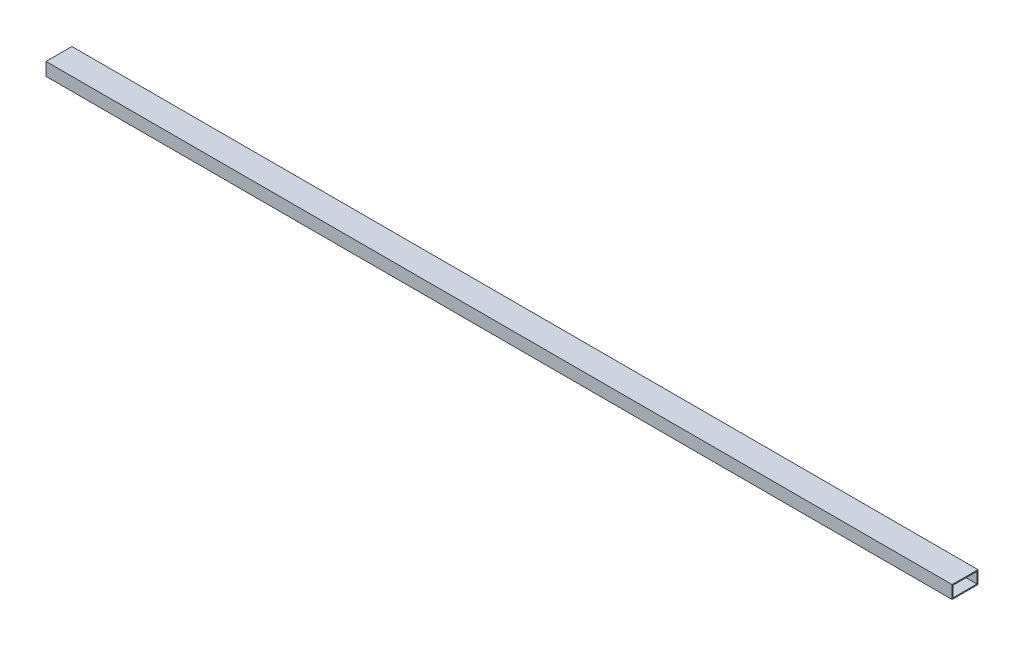
ISO-10303-21;
HEADER;
FILE_DESCRIPTION(('STEP AP214'),'2;1');
FILE_NAME('part.step','',(''),(''),'','','');
FILE_SCHEMA(('AUTOMOTIVE_DESIGN { 1 0 10303 214 1 1 1 1 }'));
ENDSEC;
DATA;
#1=APPLICATION_CONTEXT('core data for automotive mechanical design processes');
#2=APPLICATION_PROTOCOL_DEFINITION('international standard','automotive_design',2000,#1);
#3=PRODUCT_CONTEXT('',#1,'mechanical');
#4=PRODUCT('Part','Part','',(#3));
#5=PRODUCT_RELATED_PRODUCT_CATEGORY('part','',(#4));
#6=PRODUCT_DEFINITION_FORMATION('','',#4);
#7=PRODUCT_DEFINITION_CONTEXT('part definition',#1,'design');
#8=PRODUCT_DEFINITION('design','',#6,#7);
#9=PRODUCT_DEFINITION_SHAPE('','',#8);
#10=(LENGTH_UNIT() NAMED_UNIT(*) SI_UNIT(.MILLI.,.METRE.));
#11=(NAMED_UNIT(*) PLANE_ANGLE_UNIT() SI_UNIT($,.RADIAN.));
#12=(NAMED_UNIT(*) SI_UNIT($,.STERADIAN.) SOLID_ANGLE_UNIT());
#13=UNCERTAINTY_MEASURE_WITH_UNIT(LENGTH_MEASURE(1.E-05),#10,'distance_accuracy_value','');
#14=(GEOMETRIC_REPRESENTATION_CONTEXT(3) GLOBAL_UNCERTAINTY_ASSIGNED_CONTEXT((#13)) GLOBAL_UNIT_ASSIGNED_CONTEXT((#10,
#11,#12)) REPRESENTATION_CONTEXT('',''));
#15=CARTESIAN_POINT('',(0.,0.,0.));
#16=DIRECTION('',(0.,0.,1.));
#17=DIRECTION('',(1.,0.,0.));
#18=AXIS2_PLACEMENT_3D('',#15,#16,#17);
#19=CARTESIAN_POINT('',(3500.,0.,0.));
#20=DIRECTION('',(1.,0.,0.));
#21=DIRECTION('',(0.,-1.,0.));
#22=AXIS2_PLACEMENT_3D('',#19,#20,#21);
#23=PLANE('',#22);
#24=DIRECTION('',(0.,0.,1.));
#25=VECTOR('',#24,1.);
#26=CARTESIAN_POINT('',(3500.,21.,-46.));
#27=LINE('',#26,#25);
#28=CARTESIAN_POINT('',(3500.,21.,-46.));
#29=VERTEX_POINT('',#28);
#30=CARTESIAN_POINT('',(3500.,21.,46.));
#31=VERTEX_POINT('',#30);
#32=EDGE_CURVE('E141',#29,#31,#27,.T.);
#33=ORIENTED_EDGE('',*,*,#32,.F.);
#34=DIRECTION('',(0.,1.,0.));
#35=VECTOR('',#34,1.);
#36=CARTESIAN_POINT('',(3500.,-21.,-46.));
#37=LINE('',#36,#35);
#38=CARTESIAN_POINT('',(3500.,-21.,-46.));
#39=VERTEX_POINT('',#38);
#40=EDGE_CURVE('E154',#39,#29,#37,.T.);
#41=ORIENTED_EDGE('',*,*,#40,.F.);
#42=DIRECTION('',(0.,0.,-1.));
#43=VECTOR('',#42,1.);
#44=CARTESIAN_POINT('',(3500.,-21.,46.));
#45=LINE('',#44,#43);
#46=CARTESIAN_POINT('',(3500.,-21.,46.));
#47=VERTEX_POINT('',#46);
#48=EDGE_CURVE('E161',#47,#39,#45,.T.);
#49=ORIENTED_EDGE('',*,*,#48,.F.);
#50=DIRECTION('',(0.,-1.,0.));
#51=VECTOR('',#50,1.);
#52=CARTESIAN_POINT('',(3500.,21.,46.));
#53=LINE('',#52,#51);
#54=EDGE_CURVE('E25',#31,#47,#53,.T.);
#55=ORIENTED_EDGE('',*,*,#54,.F.);
#56=EDGE_LOOP('',(#33,#41,#49,#55));
#57=FACE_BOUND('',#56,.T.);
#58=DIRECTION('',(0.,-1.,0.));
#59=VECTOR('',#58,1.);
#60=CARTESIAN_POINT('',(3500.,25.,50.));
#61=LINE('',#60,#59);
#62=CARTESIAN_POINT('',(3500.,25.,50.));
#63=VERTEX_POINT('',#62);
#64=CARTESIAN_POINT('',(3500.,-25.,50.));
#65=VERTEX_POINT('',#64);
#66=EDGE_CURVE('E260',#63,#65,#61,.T.);
#67=ORIENTED_EDGE('',*,*,#66,.T.);
#68=DIRECTION('',(0.,0.,-1.));
#69=VECTOR('',#68,1.);
#70=CARTESIAN_POINT('',(3500.,-25.,50.));
#71=LINE('',#70,#69);
#72=CARTESIAN_POINT('',(3500.,-25.,-50.));
#73=VERTEX_POINT('',#72);
#74=EDGE_CURVE('E125',#65,#73,#71,.T.);
#75=ORIENTED_EDGE('',*,*,#74,.T.);
#76=DIRECTION('',(0.,1.,0.));
#77=VECTOR('',#76,1.);
#78=CARTESIAN_POINT('',(3500.,-25.,-50.));
#79=LINE('',#78,#77);
#80=CARTESIAN_POINT('',(3500.,25.,-50.));
#81=VERTEX_POINT('',#80);
#82=EDGE_CURVE('E93',#73,#81,#79,.T.);
#83=ORIENTED_EDGE('',*,*,#82,.T.);
#84=DIRECTION('',(0.,0.,1.));
#85=VECTOR('',#84,1.);
#86=CARTESIAN_POINT('',(3500.,25.,-50.));
#87=LINE('',#86,#85);
#88=EDGE_CURVE('E113',#81,#63,#87,.T.);
#89=ORIENTED_EDGE('',*,*,#88,.T.);
#90=EDGE_LOOP('',(#67,#75,#83,#89));
#91=FACE_BOUND('',#90,.T.);
#92=ADVANCED_FACE('F17',(#57,#91),#23,.T.);
#93=CARTESIAN_POINT('',(2.273736754432E-13,0.,0.));
#94=DIRECTION('',(1.,0.,0.));
#95=DIRECTION('',(0.,-1.,0.));
#96=AXIS2_PLACEMENT_3D('',#93,#94,#95);
#97=PLANE('',#96);
#98=DIRECTION('',(0.,-1.,0.));
#99=VECTOR('',#98,1.);
#100=CARTESIAN_POINT('',(2.273736754432E-13,21.,46.));
#101=LINE('',#100,#99);
#102=CARTESIAN_POINT('',(2.273736754432E-13,21.,46.));
#103=VERTEX_POINT('',#102);
#104=CARTESIAN_POINT('',(2.273736754432E-13,-21.,46.));
#105=VERTEX_POINT('',#104);
#106=EDGE_CURVE('E11',#103,#105,#101,.T.);
#107=ORIENTED_EDGE('',*,*,#106,.T.);
#108=DIRECTION('',(0.,0.,-1.));
#109=VECTOR('',#108,1.);
#110=CARTESIAN_POINT('',(2.273736754432E-13,-21.,46.));
#111=LINE('',#110,#109);
#112=CARTESIAN_POINT('',(2.273736754432E-13,-21.,-46.));
#113=VERTEX_POINT('',#112);
#114=EDGE_CURVE('E158',#105,#113,#111,.T.);
#115=ORIENTED_EDGE('',*,*,#114,.T.);
#116=DIRECTION('',(0.,1.,0.));
#117=VECTOR('',#116,1.);
#118=CARTESIAN_POINT('',(2.273736754432E-13,-21.,-46.));
#119=LINE('',#118,#117);
#120=CARTESIAN_POINT('',(2.273736754432E-13,21.,-46.));
#121=VERTEX_POINT('',#120);
#122=EDGE_CURVE('E157',#113,#121,#119,.T.);
#123=ORIENTED_EDGE('',*,*,#122,.T.);
#124=DIRECTION('',(0.,0.,1.));
#125=VECTOR('',#124,1.);
#126=CARTESIAN_POINT('',(2.273736754432E-13,21.,-46.));
#127=LINE('',#126,#125);
#128=EDGE_CURVE('E132',#121,#103,#127,.T.);
#129=ORIENTED_EDGE('',*,*,#128,.T.);
#130=EDGE_LOOP('',(#107,#115,#123,#129));
#131=FACE_BOUND('',#130,.T.);
#132=DIRECTION('',(0.,0.,1.));
#133=VECTOR('',#132,1.);
#134=CARTESIAN_POINT('',(2.273736754432E-13,25.,-50.));
#135=LINE('',#134,#133);
#136=CARTESIAN_POINT('',(2.273736754432E-13,25.,-50.));
#137=VERTEX_POINT('',#136);
#138=CARTESIAN_POINT('',(2.273736754432E-13,25.,50.));
#139=VERTEX_POINT('',#138);
#140=EDGE_CURVE('E100',#137,#139,#135,.T.);
#141=ORIENTED_EDGE('',*,*,#140,.F.);
#142=DIRECTION('',(0.,1.,0.));
#143=VECTOR('',#142,1.);
#144=CARTESIAN_POINT('',(2.273736754432E-13,-25.,-50.));
#145=LINE('',#144,#143);
#146=CARTESIAN_POINT('',(2.273736754432E-13,-25.,-50.));
#147=VERTEX_POINT('',#146);
#148=EDGE_CURVE('E105',#147,#137,#145,.T.);
#149=ORIENTED_EDGE('',*,*,#148,.F.);
#150=DIRECTION('',(0.,0.,-1.));
#151=VECTOR('',#150,1.);
#152=CARTESIAN_POINT('',(2.273736754432E-13,-25.,50.));
#153=LINE('',#152,#151);
#154=CARTESIAN_POINT('',(2.273736754432E-13,-25.,50.));
#155=VERTEX_POINT('',#154);
#156=EDGE_CURVE('E264',#155,#147,#153,.T.);
#157=ORIENTED_EDGE('',*,*,#156,.F.);
#158=DIRECTION('',(0.,-1.,0.));
#159=VECTOR('',#158,1.);
#160=CARTESIAN_POINT('',(2.273736754432E-13,25.,50.));
#161=LINE('',#160,#159);
#162=EDGE_CURVE('E108',#139,#155,#161,.T.);
#163=ORIENTED_EDGE('',*,*,#162,.F.);
#164=EDGE_LOOP('',(#141,#149,#157,#163));
#165=FACE_BOUND('',#164,.T.);
#166=ADVANCED_FACE('F102',(#131,#165),#97,.F.);
#167=CARTESIAN_POINT('',(2.273736754432E-13,21.,46.));
#168=DIRECTION('',(0.,0.,-1.));
#169=DIRECTION('',(0.,-1.,0.));
#170=AXIS2_PLACEMENT_3D('',#167,#168,#169);
#171=PLANE('',#170);
#172=DIRECTION('',(1.,0.,0.));
#173=VECTOR('',#172,1.);
#174=CARTESIAN_POINT('',(2.273736754432E-13,21.,46.));
#175=LINE('',#174,#173);
#176=EDGE_CURVE('E136',#103,#31,#175,.T.);
#177=ORIENTED_EDGE('',*,*,#176,.T.);
#178=ORIENTED_EDGE('',*,*,#54,.T.);
#179=DIRECTION('',(1.,0.,0.));
#180=VECTOR('',#179,1.);
#181=CARTESIAN_POINT('',(2.273736754432E-13,-21.,46.));
#182=LINE('',#181,#180);
#183=EDGE_CURVE('E164',#105,#47,#182,.T.);
#184=ORIENTED_EDGE('',*,*,#183,.F.);
#185=ORIENTED_EDGE('',*,*,#106,.F.);
#186=EDGE_LOOP('',(#177,#178,#184,#185));
#187=FACE_BOUND('',#186,.T.);
#188=ADVANCED_FACE('F203',(#187),#171,.T.);
#189=CARTESIAN_POINT('',(2.273736754432E-13,-21.,46.));
#190=DIRECTION('',(0.,1.,0.));
#191=DIRECTION('',(1.,0.,0.));
#192=AXIS2_PLACEMENT_3D('',#189,#190,#191);
#193=PLANE('',#192);
#194=ORIENTED_EDGE('',*,*,#183,.T.);
#195=ORIENTED_EDGE('',*,*,#48,.T.);
#196=DIRECTION('',(1.,0.,0.));
#197=VECTOR('',#196,1.);
#198=CARTESIAN_POINT('',(2.273736754432E-13,-21.,-46.));
#199=LINE('',#198,#197);
#200=EDGE_CURVE('E135',#113,#39,#199,.T.);
#201=ORIENTED_EDGE('',*,*,#200,.F.);
#202=ORIENTED_EDGE('',*,*,#114,.F.);
#203=EDGE_LOOP('',(#194,#195,#201,#202));
#204=FACE_BOUND('',#203,.T.);
#205=ADVANCED_FACE('F225',(#204),#193,.T.);
#206=CARTESIAN_POINT('',(2.273736754432E-13,-21.,-46.));
#207=DIRECTION('',(0.,0.,1.));
#208=DIRECTION('',(1.,0.,0.));
#209=AXIS2_PLACEMENT_3D('',#206,#207,#208);
#210=PLANE('',#209);
#211=ORIENTED_EDGE('',*,*,#200,.T.);
#212=ORIENTED_EDGE('',*,*,#40,.T.);
#213=DIRECTION('',(1.,0.,0.));
#214=VECTOR('',#213,1.);
#215=CARTESIAN_POINT('',(2.273736754432E-13,21.,-46.));
#216=LINE('',#215,#214);
#217=EDGE_CURVE('E137',#121,#29,#216,.T.);
#218=ORIENTED_EDGE('',*,*,#217,.F.);
#219=ORIENTED_EDGE('',*,*,#122,.F.);
#220=EDGE_LOOP('',(#211,#212,#218,#219));
#221=FACE_BOUND('',#220,.T.);
#222=ADVANCED_FACE('F217',(#221),#210,.T.);
#223=CARTESIAN_POINT('',(2.273736754432E-13,21.,-46.));
#224=DIRECTION('',(0.,-1.,0.));
#225=DIRECTION('',(-1.,0.,0.));
#226=AXIS2_PLACEMENT_3D('',#223,#224,#225);
#227=PLANE('',#226);
#228=ORIENTED_EDGE('',*,*,#217,.T.);
#229=ORIENTED_EDGE('',*,*,#32,.T.);
#230=ORIENTED_EDGE('',*,*,#176,.F.);
#231=ORIENTED_EDGE('',*,*,#128,.F.);
#232=EDGE_LOOP('',(#228,#229,#230,#231));
#233=FACE_BOUND('',#232,.T.);
#234=ADVANCED_FACE('F210',(#233),#227,.T.);
#235=CARTESIAN_POINT('',(2.273736754432E-13,25.,-50.));
#236=DIRECTION('',(0.,-1.,0.));
#237=DIRECTION('',(-1.,0.,0.));
#238=AXIS2_PLACEMENT_3D('',#235,#236,#237);
#239=PLANE('',#238);
#240=ORIENTED_EDGE('',*,*,#140,.T.);
#241=DIRECTION('',(1.,0.,0.));
#242=VECTOR('',#241,1.);
#243=CARTESIAN_POINT('',(2.273736754432E-13,25.,50.));
#244=LINE('',#243,#242);
#245=EDGE_CURVE('E262',#139,#63,#244,.T.);
#246=ORIENTED_EDGE('',*,*,#245,.T.);
#247=ORIENTED_EDGE('',*,*,#88,.F.);
#248=DIRECTION('',(1.,0.,0.));
#249=VECTOR('',#248,1.);
#250=CARTESIAN_POINT('',(2.273736754432E-13,25.,-50.));
#251=LINE('',#250,#249);
#252=EDGE_CURVE('E115',#137,#81,#251,.T.);
#253=ORIENTED_EDGE('',*,*,#252,.F.);
#254=EDGE_LOOP('',(#240,#246,#247,#253));
#255=FACE_BOUND('',#254,.T.);
#256=ADVANCED_FACE('F116',(#255),#239,.F.);
#257=CARTESIAN_POINT('',(2.273736754432E-13,-25.,-50.));
#258=DIRECTION('',(0.,0.,1.));
#259=DIRECTION('',(1.,0.,0.));
#260=AXIS2_PLACEMENT_3D('',#257,#258,#259);
#261=PLANE('',#260);
#262=ORIENTED_EDGE('',*,*,#148,.T.);
#263=ORIENTED_EDGE('',*,*,#252,.T.);
#264=ORIENTED_EDGE('',*,*,#82,.F.);
#265=DIRECTION('',(1.,0.,0.));
#266=VECTOR('',#265,1.);
#267=CARTESIAN_POINT('',(2.273736754432E-13,-25.,-50.));
#268=LINE('',#267,#266);
#269=EDGE_CURVE('E122',#147,#73,#268,.T.);
#270=ORIENTED_EDGE('',*,*,#269,.F.);
#271=EDGE_LOOP('',(#262,#263,#264,#270));
#272=FACE_BOUND('',#271,.T.);
#273=ADVANCED_FACE('F120',(#272),#261,.F.);
#274=CARTESIAN_POINT('',(2.273736754432E-13,-25.,50.));
#275=DIRECTION('',(0.,1.,0.));
#276=DIRECTION('',(1.,0.,0.));
#277=AXIS2_PLACEMENT_3D('',#274,#275,#276);
#278=PLANE('',#277);
#279=ORIENTED_EDGE('',*,*,#156,.T.);
#280=ORIENTED_EDGE('',*,*,#269,.T.);
#281=ORIENTED_EDGE('',*,*,#74,.F.);
#282=DIRECTION('',(1.,0.,0.));
#283=VECTOR('',#282,1.);
#284=CARTESIAN_POINT('',(2.273736754432E-13,-25.,50.));
#285=LINE('',#284,#283);
#286=EDGE_CURVE('E267',#155,#65,#285,.T.);
#287=ORIENTED_EDGE('',*,*,#286,.F.);
#288=EDGE_LOOP('',(#279,#280,#281,#287));
#289=FACE_BOUND('',#288,.T.);
#290=ADVANCED_FACE('F180',(#289),#278,.F.);
#291=CARTESIAN_POINT('',(2.273736754432E-13,25.,50.));
#292=DIRECTION('',(0.,0.,-1.));
#293=DIRECTION('',(0.,-1.,0.));
#294=AXIS2_PLACEMENT_3D('',#291,#292,#293);
#295=PLANE('',#294);
#296=ORIENTED_EDGE('',*,*,#162,.T.);
#297=ORIENTED_EDGE('',*,*,#286,.T.);
#298=ORIENTED_EDGE('',*,*,#66,.F.);
#299=ORIENTED_EDGE('',*,*,#245,.F.);
#300=EDGE_LOOP('',(#296,#297,#298,#299));
#301=FACE_BOUND('',#300,.T.);
#302=ADVANCED_FACE('F185',(#301),#295,.F.);
#303=CLOSED_SHELL('',(#92,#166,#188,#205,#222,#234,#256,#273,#290,#302));
#304=MANIFOLD_SOLID_BREP('B1',#303);
#305=ADVANCED_BREP_SHAPE_REPRESENTATION('',(#18,#304),#14);
#306=SHAPE_DEFINITION_REPRESENTATION(#9,#305);
ENDSEC;
END-ISO-10303-21;
